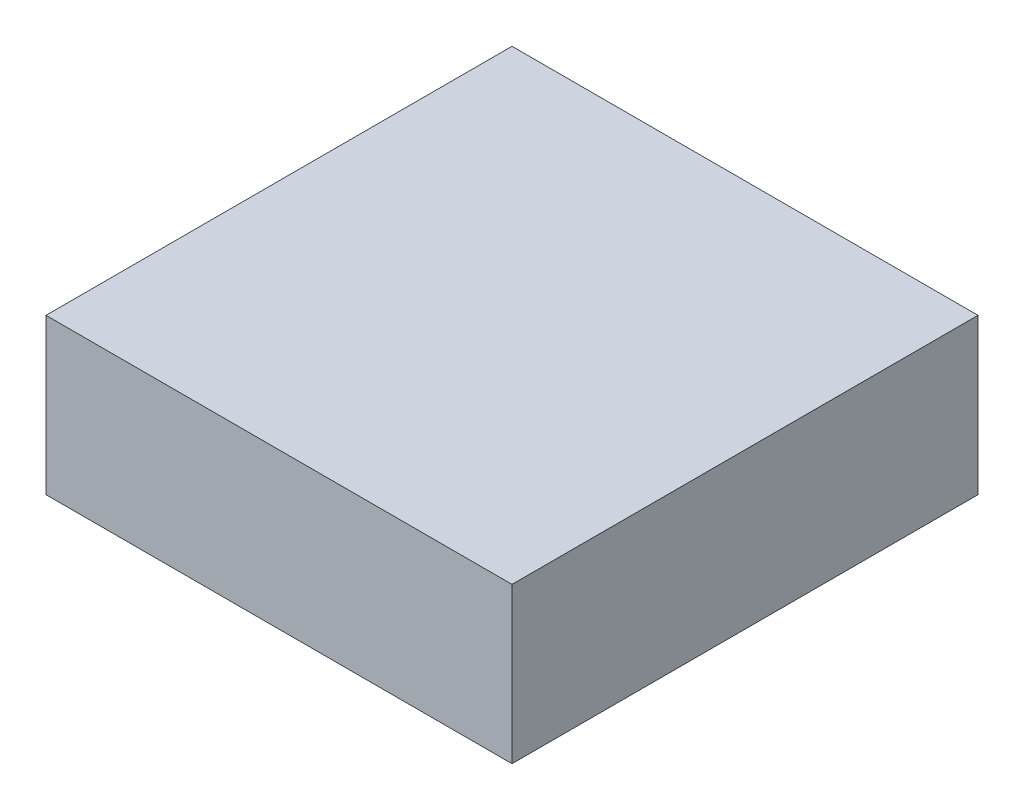
ISO-10303-21;
HEADER;
FILE_DESCRIPTION(('STEP AP214'),'2;1');
FILE_NAME('part.step','',(''),(''),'','','');
FILE_SCHEMA(('AUTOMOTIVE_DESIGN { 1 0 10303 214 1 1 1 1 }'));
ENDSEC;
DATA;
#1=APPLICATION_CONTEXT('core data for automotive mechanical design processes');
#2=APPLICATION_PROTOCOL_DEFINITION('international standard','automotive_design',2000,#1);
#3=PRODUCT_CONTEXT('',#1,'mechanical');
#4=PRODUCT('Part','Part','',(#3));
#5=PRODUCT_RELATED_PRODUCT_CATEGORY('part','',(#4));
#6=PRODUCT_DEFINITION_FORMATION('','',#4);
#7=PRODUCT_DEFINITION_CONTEXT('part definition',#1,'design');
#8=PRODUCT_DEFINITION('design','',#6,#7);
#9=PRODUCT_DEFINITION_SHAPE('','',#8);
#10=(LENGTH_UNIT() NAMED_UNIT(*) SI_UNIT(.MILLI.,.METRE.));
#11=(NAMED_UNIT(*) PLANE_ANGLE_UNIT() SI_UNIT($,.RADIAN.));
#12=(NAMED_UNIT(*) SI_UNIT($,.STERADIAN.) SOLID_ANGLE_UNIT());
#13=UNCERTAINTY_MEASURE_WITH_UNIT(LENGTH_MEASURE(1.E-05),#10,'distance_accuracy_value','');
#14=(GEOMETRIC_REPRESENTATION_CONTEXT(3) GLOBAL_UNCERTAINTY_ASSIGNED_CONTEXT((#13)) GLOBAL_UNIT_ASSIGNED_CONTEXT((#10,
#11,#12)) REPRESENTATION_CONTEXT('',''));
#15=CARTESIAN_POINT('',(0.,0.,0.));
#16=DIRECTION('',(0.,0.,1.));
#17=DIRECTION('',(1.,0.,0.));
#18=AXIS2_PLACEMENT_3D('',#15,#16,#17);
#19=CARTESIAN_POINT('',(600.,400.,600.));
#20=DIRECTION('',(-1.,0.,0.));
#21=DIRECTION('',(0.,0.,1.));
#22=AXIS2_PLACEMENT_3D('',#19,#20,#21);
#23=PLANE('',#22);
#24=DIRECTION('',(0.,0.,-1.));
#25=VECTOR('',#24,1.);
#26=CARTESIAN_POINT('',(600.,0.,600.));
#27=LINE('',#26,#25);
#28=CARTESIAN_POINT('',(600.,0.,600.));
#29=VERTEX_POINT('',#28);
#30=CARTESIAN_POINT('',(600.,0.,-600.));
#31=VERTEX_POINT('',#30);
#32=EDGE_CURVE('E114',#29,#31,#27,.T.);
#33=ORIENTED_EDGE('',*,*,#32,.T.);
#34=DIRECTION('',(0.,-1.,0.));
#35=VECTOR('',#34,1.);
#36=CARTESIAN_POINT('',(600.,400.,-600.));
#37=LINE('',#36,#35);
#38=CARTESIAN_POINT('',(600.,400.,-600.));
#39=VERTEX_POINT('',#38);
#40=EDGE_CURVE('E11',#39,#31,#37,.T.);
#41=ORIENTED_EDGE('',*,*,#40,.F.);
#42=DIRECTION('',(0.,0.,-1.));
#43=VECTOR('',#42,1.);
#44=CARTESIAN_POINT('',(600.,400.,600.));
#45=LINE('',#44,#43);
#46=CARTESIAN_POINT('',(600.,400.,600.));
#47=VERTEX_POINT('',#46);
#48=EDGE_CURVE('E100',#47,#39,#45,.T.);
#49=ORIENTED_EDGE('',*,*,#48,.F.);
#50=DIRECTION('',(0.,-1.,0.));
#51=VECTOR('',#50,1.);
#52=CARTESIAN_POINT('',(600.,400.,600.));
#53=LINE('',#52,#51);
#54=EDGE_CURVE('E108',#47,#29,#53,.T.);
#55=ORIENTED_EDGE('',*,*,#54,.T.);
#56=EDGE_LOOP('',(#33,#41,#49,#55));
#57=FACE_BOUND('',#56,.T.);
#58=ADVANCED_FACE('F44',(#57),#23,.F.);
#59=CARTESIAN_POINT('',(-600.,400.,-600.));
#60=DIRECTION('',(0.,0.,1.));
#61=DIRECTION('',(1.,0.,0.));
#62=AXIS2_PLACEMENT_3D('',#59,#60,#61);
#63=PLANE('',#62);
#64=DIRECTION('',(-1.,0.,0.));
#65=VECTOR('',#64,1.);
#66=CARTESIAN_POINT('',(-600.,0.,-600.));
#67=LINE('',#66,#65);
#68=CARTESIAN_POINT('',(-600.,0.,-600.));
#69=VERTEX_POINT('',#68);
#70=EDGE_CURVE('E105',#31,#69,#67,.T.);
#71=ORIENTED_EDGE('',*,*,#70,.T.);
#72=DIRECTION('',(0.,-1.,0.));
#73=VECTOR('',#72,1.);
#74=CARTESIAN_POINT('',(-600.,400.,-600.));
#75=LINE('',#74,#73);
#76=CARTESIAN_POINT('',(-600.,400.,-600.));
#77=VERTEX_POINT('',#76);
#78=EDGE_CURVE('E53',#77,#69,#75,.T.);
#79=ORIENTED_EDGE('',*,*,#78,.F.);
#80=DIRECTION('',(-1.,0.,0.));
#81=VECTOR('',#80,1.);
#82=CARTESIAN_POINT('',(-600.,400.,-600.));
#83=LINE('',#82,#81);
#84=EDGE_CURVE('E95',#39,#77,#83,.T.);
#85=ORIENTED_EDGE('',*,*,#84,.F.);
#86=ORIENTED_EDGE('',*,*,#40,.T.);
#87=EDGE_LOOP('',(#71,#79,#85,#86));
#88=FACE_BOUND('',#87,.T.);
#89=ADVANCED_FACE('F101',(#88),#63,.F.);
#90=CARTESIAN_POINT('',(-600.,400.,600.));
#91=DIRECTION('',(1.,0.,0.));
#92=DIRECTION('',(0.,0.,-1.));
#93=AXIS2_PLACEMENT_3D('',#90,#91,#92);
#94=PLANE('',#93);
#95=DIRECTION('',(0.,0.,1.));
#96=VECTOR('',#95,1.);
#97=CARTESIAN_POINT('',(-600.,0.,600.));
#98=LINE('',#97,#96);
#99=CARTESIAN_POINT('',(-600.,0.,600.));
#100=VERTEX_POINT('',#99);
#101=EDGE_CURVE('E76',#69,#100,#98,.T.);
#102=ORIENTED_EDGE('',*,*,#101,.T.);
#103=DIRECTION('',(0.,-1.,0.));
#104=VECTOR('',#103,1.);
#105=CARTESIAN_POINT('',(-600.,400.,600.));
#106=LINE('',#105,#104);
#107=CARTESIAN_POINT('',(-600.,400.,600.));
#108=VERTEX_POINT('',#107);
#109=EDGE_CURVE('E102',#108,#100,#106,.T.);
#110=ORIENTED_EDGE('',*,*,#109,.F.);
#111=DIRECTION('',(0.,0.,1.));
#112=VECTOR('',#111,1.);
#113=CARTESIAN_POINT('',(-600.,400.,600.));
#114=LINE('',#113,#112);
#115=EDGE_CURVE('E92',#77,#108,#114,.T.);
#116=ORIENTED_EDGE('',*,*,#115,.F.);
#117=ORIENTED_EDGE('',*,*,#78,.T.);
#118=EDGE_LOOP('',(#102,#110,#116,#117));
#119=FACE_BOUND('',#118,.T.);
#120=ADVANCED_FACE('F104',(#119),#94,.F.);
#121=CARTESIAN_POINT('',(-600.,400.,600.));
#122=DIRECTION('',(0.,0.,-1.));
#123=DIRECTION('',(-1.,0.,0.));
#124=AXIS2_PLACEMENT_3D('',#121,#122,#123);
#125=PLANE('',#124);
#126=DIRECTION('',(1.,0.,0.));
#127=VECTOR('',#126,1.);
#128=CARTESIAN_POINT('',(-600.,0.,600.));
#129=LINE('',#128,#127);
#130=EDGE_CURVE('E83',#100,#29,#129,.T.);
#131=ORIENTED_EDGE('',*,*,#130,.T.);
#132=ORIENTED_EDGE('',*,*,#54,.F.);
#133=DIRECTION('',(1.,0.,0.));
#134=VECTOR('',#133,1.);
#135=CARTESIAN_POINT('',(-600.,400.,600.));
#136=LINE('',#135,#134);
#137=EDGE_CURVE('E65',#108,#47,#136,.T.);
#138=ORIENTED_EDGE('',*,*,#137,.F.);
#139=ORIENTED_EDGE('',*,*,#109,.T.);
#140=EDGE_LOOP('',(#131,#132,#138,#139));
#141=FACE_BOUND('',#140,.T.);
#142=ADVANCED_FACE('F127',(#141),#125,.F.);
#143=CARTESIAN_POINT('',(0.,400.,0.));
#144=DIRECTION('',(0.,-1.,0.));
#145=DIRECTION('',(0.,0.,-1.));
#146=AXIS2_PLACEMENT_3D('',#143,#144,#145);
#147=PLANE('',#146);
#148=ORIENTED_EDGE('',*,*,#48,.T.);
#149=ORIENTED_EDGE('',*,*,#84,.T.);
#150=ORIENTED_EDGE('',*,*,#115,.T.);
#151=ORIENTED_EDGE('',*,*,#137,.T.);
#152=EDGE_LOOP('',(#148,#149,#150,#151));
#153=FACE_BOUND('',#152,.T.);
#154=ADVANCED_FACE('F91',(#153),#147,.F.);
#155=CARTESIAN_POINT('',(0.,0.,0.));
#156=DIRECTION('',(0.,-1.,0.));
#157=DIRECTION('',(0.,0.,-1.));
#158=AXIS2_PLACEMENT_3D('',#155,#156,#157);
#159=PLANE('',#158);
#160=ORIENTED_EDGE('',*,*,#32,.F.);
#161=ORIENTED_EDGE('',*,*,#130,.F.);
#162=ORIENTED_EDGE('',*,*,#101,.F.);
#163=ORIENTED_EDGE('',*,*,#70,.F.);
#164=EDGE_LOOP('',(#160,#161,#162,#163));
#165=FACE_BOUND('',#164,.T.);
#166=ADVANCED_FACE('F129',(#165),#159,.T.);
#167=CLOSED_SHELL('',(#58,#89,#120,#142,#154,#166));
#168=MANIFOLD_SOLID_BREP('B2',#167);
#169=ADVANCED_BREP_SHAPE_REPRESENTATION('',(#18,#168),#14);
#170=SHAPE_DEFINITION_REPRESENTATION(#9,#169);
ENDSEC;
END-ISO-10303-21;
